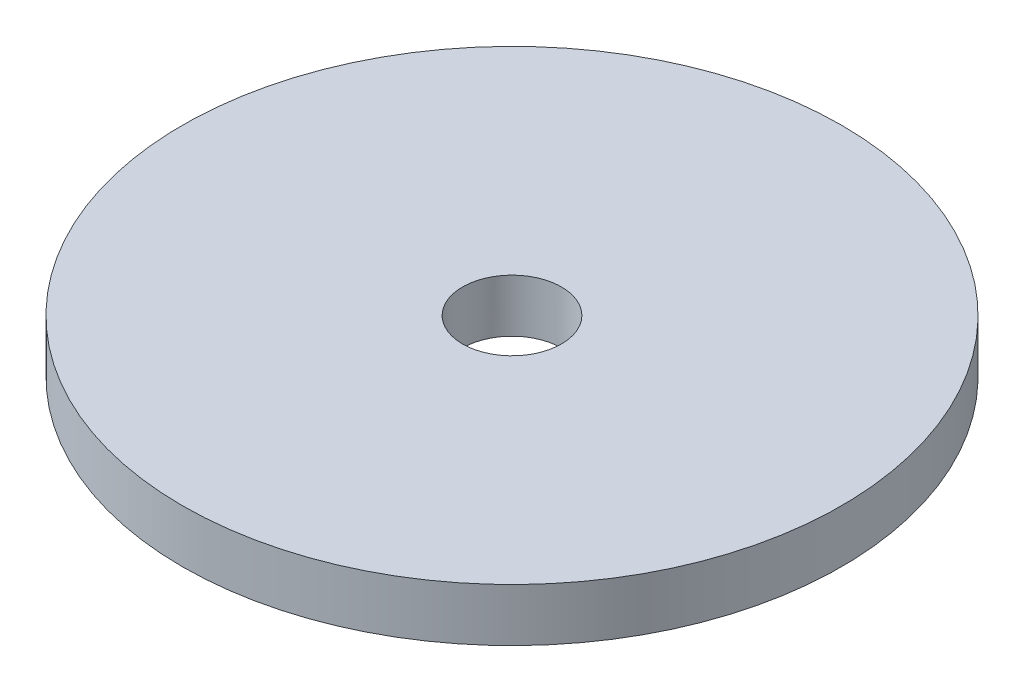
ISO-10303-21;
HEADER;
FILE_DESCRIPTION(('STEP AP214'),'2;1');
FILE_NAME('part.step','',(''),(''),'','','');
FILE_SCHEMA(('AUTOMOTIVE_DESIGN { 1 0 10303 214 1 1 1 1 }'));
ENDSEC;
DATA;
#1=APPLICATION_CONTEXT('core data for automotive mechanical design processes');
#2=APPLICATION_PROTOCOL_DEFINITION('international standard','automotive_design',2000,#1);
#3=PRODUCT_CONTEXT('',#1,'mechanical');
#4=PRODUCT('Part','Part','',(#3));
#5=PRODUCT_RELATED_PRODUCT_CATEGORY('part','',(#4));
#6=PRODUCT_DEFINITION_FORMATION('','',#4);
#7=PRODUCT_DEFINITION_CONTEXT('part definition',#1,'design');
#8=PRODUCT_DEFINITION('design','',#6,#7);
#9=PRODUCT_DEFINITION_SHAPE('','',#8);
#10=(LENGTH_UNIT() NAMED_UNIT(*) SI_UNIT(.MILLI.,.METRE.));
#11=(NAMED_UNIT(*) PLANE_ANGLE_UNIT() SI_UNIT($,.RADIAN.));
#12=(NAMED_UNIT(*) SI_UNIT($,.STERADIAN.) SOLID_ANGLE_UNIT());
#13=UNCERTAINTY_MEASURE_WITH_UNIT(LENGTH_MEASURE(1.E-05),#10,'distance_accuracy_value','');
#14=(GEOMETRIC_REPRESENTATION_CONTEXT(3) GLOBAL_UNCERTAINTY_ASSIGNED_CONTEXT((#13)) GLOBAL_UNIT_ASSIGNED_CONTEXT((#10,
#11,#12)) REPRESENTATION_CONTEXT('',''));
#15=CARTESIAN_POINT('',(0.,0.,0.));
#16=DIRECTION('',(0.,0.,1.));
#17=DIRECTION('',(1.,0.,0.));
#18=AXIS2_PLACEMENT_3D('',#15,#16,#17);
#19=CARTESIAN_POINT('',(0.,20.7442682772214,0.));
#20=DIRECTION('',(0.,-1.,0.));
#21=DIRECTION('',(0.,0.,-1.));
#22=AXIS2_PLACEMENT_3D('',#19,#20,#21);
#23=PLANE('',#22);
#24=CARTESIAN_POINT('',(0.,20.7442682772214,0.));
#25=DIRECTION('',(0.,-1.,0.));
#26=DIRECTION('',(0.,0.,-1.));
#27=AXIS2_PLACEMENT_3D('',#24,#25,#26);
#28=CIRCLE('',#27,3.);
#29=CARTESIAN_POINT('',(0.,20.7442682772214,-3.));
#30=VERTEX_POINT('',#29);
#31=EDGE_CURVE('E38',#30,#30,#28,.F.);
#32=ORIENTED_EDGE('',*,*,#31,.T.);
#33=EDGE_LOOP('',(#32));
#34=FACE_BOUND('',#33,.T.);
#35=CARTESIAN_POINT('',(0.,20.7442682772214,0.));
#36=DIRECTION('',(0.,-1.,0.));
#37=DIRECTION('',(0.,0.,-1.));
#38=AXIS2_PLACEMENT_3D('',#35,#36,#37);
#39=CIRCLE('',#38,20.);
#40=CARTESIAN_POINT('',(0.,20.7442682772214,-20.));
#41=VERTEX_POINT('',#40);
#42=EDGE_CURVE('E44',#41,#41,#39,.T.);
#43=ORIENTED_EDGE('',*,*,#42,.T.);
#44=EDGE_LOOP('',(#43));
#45=FACE_BOUND('',#44,.T.);
#46=ADVANCED_FACE('F30',(#34,#45),#23,.T.);
#47=CARTESIAN_POINT('',(0.,23.9548884201905,0.));
#48=DIRECTION('',(0.,-1.,0.));
#49=DIRECTION('',(0.,0.,-1.));
#50=AXIS2_PLACEMENT_3D('',#47,#48,#49);
#51=PLANE('',#50);
#52=CARTESIAN_POINT('',(0.,23.9548884201905,0.));
#53=DIRECTION('',(0.,1.,0.));
#54=DIRECTION('',(0.,0.,1.));
#55=AXIS2_PLACEMENT_3D('',#52,#53,#54);
#56=CIRCLE('',#55,3.);
#57=CARTESIAN_POINT('',(0.,23.9548884201905,3.));
#58=VERTEX_POINT('',#57);
#59=EDGE_CURVE('E10',#58,#58,#56,.T.);
#60=ORIENTED_EDGE('',*,*,#59,.F.);
#61=EDGE_LOOP('',(#60));
#62=FACE_BOUND('',#61,.T.);
#63=CARTESIAN_POINT('',(0.,23.9548884201905,0.));
#64=DIRECTION('',(0.,-1.,0.));
#65=DIRECTION('',(0.,0.,-1.));
#66=AXIS2_PLACEMENT_3D('',#63,#64,#65);
#67=CIRCLE('',#66,20.);
#68=CARTESIAN_POINT('',(0.,23.9548884201905,-20.));
#69=VERTEX_POINT('',#68);
#70=EDGE_CURVE('E34',#69,#69,#67,.T.);
#71=ORIENTED_EDGE('',*,*,#70,.F.);
#72=EDGE_LOOP('',(#71));
#73=FACE_BOUND('',#72,.T.);
#74=ADVANCED_FACE('F53',(#62,#73),#51,.F.);
#75=CARTESIAN_POINT('',(0.,3.95488842019055,0.));
#76=DIRECTION('',(0.,1.,0.));
#77=DIRECTION('',(0.,0.,1.));
#78=AXIS2_PLACEMENT_3D('',#75,#76,#77);
#79=CYLINDRICAL_SURFACE('',#78,3.);
#80=ORIENTED_EDGE('',*,*,#59,.T.);
#81=EDGE_LOOP('',(#80));
#82=FACE_BOUND('',#81,.T.);
#83=ORIENTED_EDGE('',*,*,#31,.F.);
#84=EDGE_LOOP('',(#83));
#85=FACE_BOUND('',#84,.T.);
#86=ADVANCED_FACE('F32',(#82,#85),#79,.F.);
#87=CARTESIAN_POINT('',(0.,30.7442682772214,0.));
#88=DIRECTION('',(0.,-1.,0.));
#89=DIRECTION('',(0.,0.,-1.));
#90=AXIS2_PLACEMENT_3D('',#87,#88,#89);
#91=CYLINDRICAL_SURFACE('',#90,20.);
#92=ORIENTED_EDGE('',*,*,#42,.F.);
#93=EDGE_LOOP('',(#92));
#94=FACE_BOUND('',#93,.T.);
#95=ORIENTED_EDGE('',*,*,#70,.T.);
#96=EDGE_LOOP('',(#95));
#97=FACE_BOUND('',#96,.T.);
#98=ADVANCED_FACE('F51',(#94,#97),#91,.T.);
#99=CLOSED_SHELL('',(#46,#74,#86,#98));
#100=MANIFOLD_SOLID_BREP('B2',#99);
#101=ADVANCED_BREP_SHAPE_REPRESENTATION('',(#18,#100),#14);
#102=SHAPE_DEFINITION_REPRESENTATION(#9,#101);
ENDSEC;
END-ISO-10303-21;
